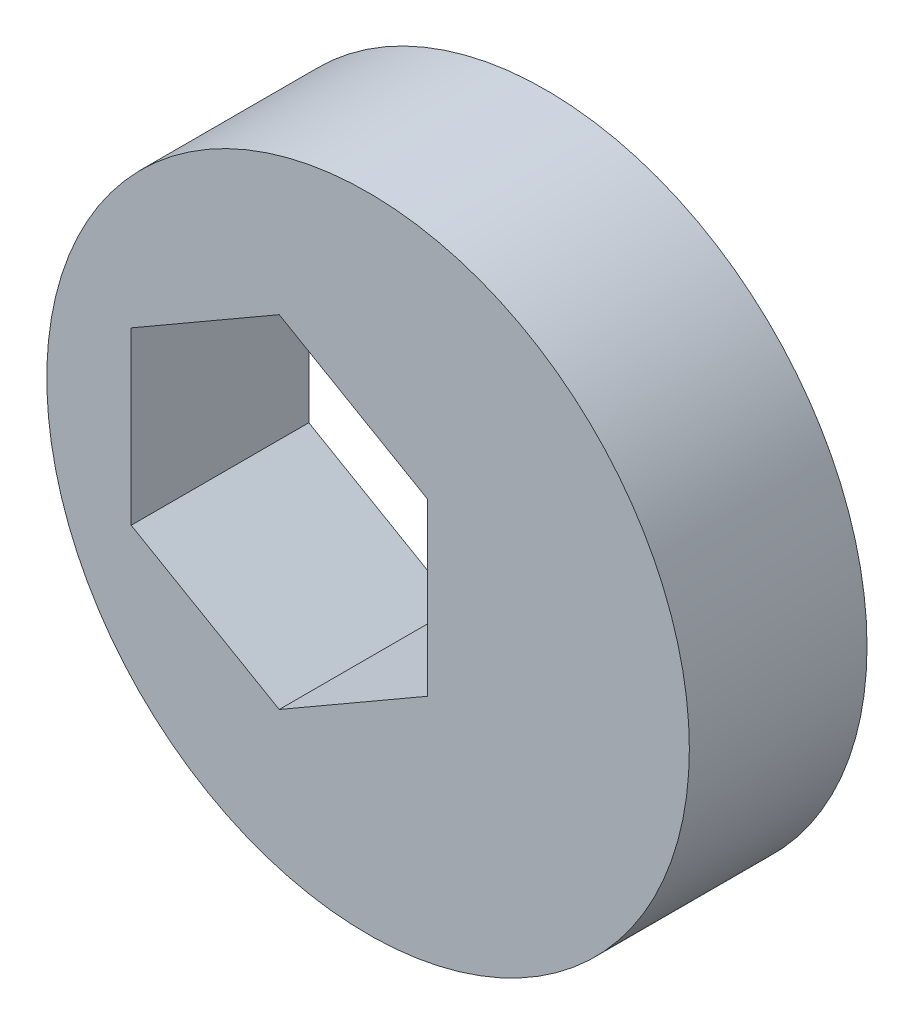
ISO-10303-21;
HEADER;
FILE_DESCRIPTION(('STEP AP214'),'2;1');
FILE_NAME('part.step','',(''),(''),'','','');
FILE_SCHEMA(('AUTOMOTIVE_DESIGN { 1 0 10303 214 1 1 1 1 }'));
ENDSEC;
DATA;
#1=APPLICATION_CONTEXT('core data for automotive mechanical design processes');
#2=APPLICATION_PROTOCOL_DEFINITION('international standard','automotive_design',2000,#1);
#3=PRODUCT_CONTEXT('',#1,'mechanical');
#4=PRODUCT('Part','Part','',(#3));
#5=PRODUCT_RELATED_PRODUCT_CATEGORY('part','',(#4));
#6=PRODUCT_DEFINITION_FORMATION('','',#4);
#7=PRODUCT_DEFINITION_CONTEXT('part definition',#1,'design');
#8=PRODUCT_DEFINITION('design','',#6,#7);
#9=PRODUCT_DEFINITION_SHAPE('','',#8);
#10=(LENGTH_UNIT() NAMED_UNIT(*) SI_UNIT(.MILLI.,.METRE.));
#11=(NAMED_UNIT(*) PLANE_ANGLE_UNIT() SI_UNIT($,.RADIAN.));
#12=(NAMED_UNIT(*) SI_UNIT($,.STERADIAN.) SOLID_ANGLE_UNIT());
#13=UNCERTAINTY_MEASURE_WITH_UNIT(LENGTH_MEASURE(1.E-05),#10,'distance_accuracy_value','');
#14=(GEOMETRIC_REPRESENTATION_CONTEXT(3) GLOBAL_UNCERTAINTY_ASSIGNED_CONTEXT((#13)) GLOBAL_UNIT_ASSIGNED_CONTEXT((#10,
#11,#12)) REPRESENTATION_CONTEXT('',''));
#15=CARTESIAN_POINT('',(0.,0.,0.));
#16=DIRECTION('',(0.,0.,1.));
#17=DIRECTION('',(1.,0.,0.));
#18=AXIS2_PLACEMENT_3D('',#15,#16,#17);
#19=CARTESIAN_POINT('',(3.55037457508512,0.,-4.2));
#20=DIRECTION('',(0.,0.,1.));
#21=DIRECTION('',(1.,0.,0.));
#22=AXIS2_PLACEMENT_3D('',#19,#20,#21);
#23=CYLINDRICAL_SURFACE('',#22,4.34);
#24=CARTESIAN_POINT('',(3.55037457508512,0.,-4.2));
#25=DIRECTION('',(0.,0.,1.));
#26=DIRECTION('',(1.,0.,0.));
#27=AXIS2_PLACEMENT_3D('',#24,#25,#26);
#28=CIRCLE('',#27,4.34);
#29=CARTESIAN_POINT('',(7.89037457508512,0.,-4.2));
#30=VERTEX_POINT('',#29);
#31=EDGE_CURVE('E11',#30,#30,#28,.T.);
#32=ORIENTED_EDGE('',*,*,#31,.T.);
#33=EDGE_LOOP('',(#32));
#34=FACE_BOUND('',#33,.T.);
#35=CARTESIAN_POINT('',(3.55037457508512,0.,-1.8));
#36=DIRECTION('',(0.,0.,1.));
#37=DIRECTION('',(1.,0.,0.));
#38=AXIS2_PLACEMENT_3D('',#35,#36,#37);
#39=CIRCLE('',#38,4.34);
#40=CARTESIAN_POINT('',(7.89037457508512,0.,-1.8));
#41=VERTEX_POINT('',#40);
#42=EDGE_CURVE('E49',#41,#41,#39,.T.);
#43=ORIENTED_EDGE('',*,*,#42,.F.);
#44=EDGE_LOOP('',(#43));
#45=FACE_BOUND('',#44,.T.);
#46=ADVANCED_FACE('F46',(#34,#45),#23,.T.);
#47=CARTESIAN_POINT('',(3.55037457508512,0.,-4.2));
#48=DIRECTION('',(0.,0.,1.));
#49=DIRECTION('',(1.,0.,0.));
#50=AXIS2_PLACEMENT_3D('',#47,#48,#49);
#51=PLANE('',#50);
#52=DIRECTION('',(0.,1.,0.));
#53=VECTOR('',#52,1.);
#54=CARTESIAN_POINT('',(4.35037457508512,-1.15470053837926,-4.2));
#55=LINE('',#54,#53);
#56=CARTESIAN_POINT('',(4.35037457508512,-1.15470053837926,-4.2));
#57=VERTEX_POINT('',#56);
#58=CARTESIAN_POINT('',(4.35037457508512,1.15470053837926,-4.2));
#59=VERTEX_POINT('',#58);
#60=EDGE_CURVE('E108',#57,#59,#55,.T.);
#61=ORIENTED_EDGE('',*,*,#60,.T.);
#62=DIRECTION('',(-0.866025403784439,0.5,0.));
#63=VECTOR('',#62,1.);
#64=CARTESIAN_POINT('',(4.35037457508512,1.15470053837926,-4.2));
#65=LINE('',#64,#63);
#66=CARTESIAN_POINT('',(2.35037457508512,2.30940107675851,-4.2));
#67=VERTEX_POINT('',#66);
#68=EDGE_CURVE('E101',#59,#67,#65,.T.);
#69=ORIENTED_EDGE('',*,*,#68,.T.);
#70=DIRECTION('',(-0.866025403784439,-0.5,0.));
#71=VECTOR('',#70,1.);
#72=CARTESIAN_POINT('',(2.35037457508512,2.30940107675851,-4.2));
#73=LINE('',#72,#71);
#74=CARTESIAN_POINT('',(0.350374575085108,1.15470053837926,-4.2));
#75=VERTEX_POINT('',#74);
#76=EDGE_CURVE('E111',#67,#75,#73,.T.);
#77=ORIENTED_EDGE('',*,*,#76,.T.);
#78=DIRECTION('',(0.,-1.,0.));
#79=VECTOR('',#78,1.);
#80=CARTESIAN_POINT('',(0.350374575085107,1.15470053837926,-4.2));
#81=LINE('',#80,#79);
#82=CARTESIAN_POINT('',(0.350374575085107,-1.15470053837926,-4.2));
#83=VERTEX_POINT('',#82);
#84=EDGE_CURVE('E61',#75,#83,#81,.T.);
#85=ORIENTED_EDGE('',*,*,#84,.T.);
#86=DIRECTION('',(0.866025403784438,-0.5,0.));
#87=VECTOR('',#86,1.);
#88=CARTESIAN_POINT('',(0.350374575085107,-1.15470053837926,-4.2));
#89=LINE('',#88,#87);
#90=CARTESIAN_POINT('',(2.35037457508511,-2.30940107675851,-4.2));
#91=VERTEX_POINT('',#90);
#92=EDGE_CURVE('E130',#83,#91,#89,.T.);
#93=ORIENTED_EDGE('',*,*,#92,.T.);
#94=DIRECTION('',(0.866025403784439,0.5,0.));
#95=VECTOR('',#94,1.);
#96=CARTESIAN_POINT('',(2.35037457508511,-2.30940107675851,-4.2));
#97=LINE('',#96,#95);
#98=EDGE_CURVE('E134',#91,#57,#97,.T.);
#99=ORIENTED_EDGE('',*,*,#98,.T.);
#100=EDGE_LOOP('',(#61,#69,#77,#85,#93,#99));
#101=FACE_BOUND('',#100,.T.);
#102=ORIENTED_EDGE('',*,*,#31,.F.);
#103=EDGE_LOOP('',(#102));
#104=FACE_BOUND('',#103,.T.);
#105=ADVANCED_FACE('F116',(#101,#104),#51,.F.);
#106=CARTESIAN_POINT('',(3.55037457508512,0.,-1.8));
#107=DIRECTION('',(0.,0.,1.));
#108=DIRECTION('',(1.,0.,0.));
#109=AXIS2_PLACEMENT_3D('',#106,#107,#108);
#110=PLANE('',#109);
#111=DIRECTION('',(-0.866025403784439,0.5,0.));
#112=VECTOR('',#111,1.);
#113=CARTESIAN_POINT('',(4.35037457508512,1.15470053837926,-1.8));
#114=LINE('',#113,#112);
#115=CARTESIAN_POINT('',(4.35037457508512,1.15470053837926,-1.8));
#116=VERTEX_POINT('',#115);
#117=CARTESIAN_POINT('',(2.35037457508512,2.30940107675851,-1.8));
#118=VERTEX_POINT('',#117);
#119=EDGE_CURVE('E69',#116,#118,#114,.T.);
#120=ORIENTED_EDGE('',*,*,#119,.F.);
#121=DIRECTION('',(0.,1.,0.));
#122=VECTOR('',#121,1.);
#123=CARTESIAN_POINT('',(4.35037457508512,-1.15470053837926,-1.8));
#124=LINE('',#123,#122);
#125=CARTESIAN_POINT('',(4.35037457508512,-1.15470053837926,-1.8));
#126=VERTEX_POINT('',#125);
#127=EDGE_CURVE('E121',#126,#116,#124,.T.);
#128=ORIENTED_EDGE('',*,*,#127,.F.);
#129=DIRECTION('',(0.866025403784439,0.5,0.));
#130=VECTOR('',#129,1.);
#131=CARTESIAN_POINT('',(2.35037457508511,-2.30940107675851,-1.8));
#132=LINE('',#131,#130);
#133=CARTESIAN_POINT('',(2.35037457508511,-2.30940107675851,-1.8));
#134=VERTEX_POINT('',#133);
#135=EDGE_CURVE('E125',#134,#126,#132,.T.);
#136=ORIENTED_EDGE('',*,*,#135,.F.);
#137=DIRECTION('',(0.866025403784438,-0.5,0.));
#138=VECTOR('',#137,1.);
#139=CARTESIAN_POINT('',(0.350374575085107,-1.15470053837926,-1.8));
#140=LINE('',#139,#138);
#141=CARTESIAN_POINT('',(0.350374575085107,-1.15470053837926,-1.8));
#142=VERTEX_POINT('',#141);
#143=EDGE_CURVE('E148',#142,#134,#140,.T.);
#144=ORIENTED_EDGE('',*,*,#143,.F.);
#145=DIRECTION('',(0.,-1.,0.));
#146=VECTOR('',#145,1.);
#147=CARTESIAN_POINT('',(0.350374575085107,1.15470053837926,-1.8));
#148=LINE('',#147,#146);
#149=CARTESIAN_POINT('',(0.350374575085107,1.15470053837926,-1.8));
#150=VERTEX_POINT('',#149);
#151=EDGE_CURVE('E144',#150,#142,#148,.T.);
#152=ORIENTED_EDGE('',*,*,#151,.F.);
#153=DIRECTION('',(-0.866025403784439,-0.5,0.));
#154=VECTOR('',#153,1.);
#155=CARTESIAN_POINT('',(2.35037457508512,2.30940107675851,-1.8));
#156=LINE('',#155,#154);
#157=EDGE_CURVE('E141',#118,#150,#156,.T.);
#158=ORIENTED_EDGE('',*,*,#157,.F.);
#159=EDGE_LOOP('',(#120,#128,#136,#144,#152,#158));
#160=FACE_BOUND('',#159,.T.);
#161=ORIENTED_EDGE('',*,*,#42,.T.);
#162=EDGE_LOOP('',(#161));
#163=FACE_BOUND('',#162,.T.);
#164=ADVANCED_FACE('F172',(#160,#163),#110,.T.);
#165=CARTESIAN_POINT('',(4.35037457508512,1.15470053837926,-4.2));
#166=DIRECTION('',(0.5,0.866025403784439,0.));
#167=DIRECTION('',(-0.866025403784439,0.5,0.));
#168=AXIS2_PLACEMENT_3D('',#165,#166,#167);
#169=PLANE('',#168);
#170=ORIENTED_EDGE('',*,*,#119,.T.);
#171=DIRECTION('',(0.,0.,1.));
#172=VECTOR('',#171,1.);
#173=CARTESIAN_POINT('',(2.35037457508512,2.30940107675851,-4.2));
#174=LINE('',#173,#172);
#175=EDGE_CURVE('E97',#67,#118,#174,.T.);
#176=ORIENTED_EDGE('',*,*,#175,.F.);
#177=ORIENTED_EDGE('',*,*,#68,.F.);
#178=DIRECTION('',(0.,0.,1.));
#179=VECTOR('',#178,1.);
#180=CARTESIAN_POINT('',(4.35037457508512,1.15470053837926,-4.2));
#181=LINE('',#180,#179);
#182=EDGE_CURVE('E155',#59,#116,#181,.T.);
#183=ORIENTED_EDGE('',*,*,#182,.T.);
#184=EDGE_LOOP('',(#170,#176,#177,#183));
#185=FACE_BOUND('',#184,.T.);
#186=ADVANCED_FACE('F99',(#185),#169,.F.);
#187=CARTESIAN_POINT('',(4.35037457508512,-1.15470053837926,-4.2));
#188=DIRECTION('',(1.,0.,0.));
#189=DIRECTION('',(0.,0.,-1.));
#190=AXIS2_PLACEMENT_3D('',#187,#188,#189);
#191=PLANE('',#190);
#192=ORIENTED_EDGE('',*,*,#127,.T.);
#193=ORIENTED_EDGE('',*,*,#182,.F.);
#194=ORIENTED_EDGE('',*,*,#60,.F.);
#195=DIRECTION('',(0.,0.,1.));
#196=VECTOR('',#195,1.);
#197=CARTESIAN_POINT('',(4.35037457508512,-1.15470053837926,-4.2));
#198=LINE('',#197,#196);
#199=EDGE_CURVE('E158',#57,#126,#198,.T.);
#200=ORIENTED_EDGE('',*,*,#199,.T.);
#201=EDGE_LOOP('',(#192,#193,#194,#200));
#202=FACE_BOUND('',#201,.T.);
#203=ADVANCED_FACE('F183',(#202),#191,.F.);
#204=CARTESIAN_POINT('',(2.35037457508511,-2.30940107675851,-4.2));
#205=DIRECTION('',(0.5,-0.866025403784439,0.));
#206=DIRECTION('',(0.866025403784439,0.5,0.));
#207=AXIS2_PLACEMENT_3D('',#204,#205,#206);
#208=PLANE('',#207);
#209=ORIENTED_EDGE('',*,*,#135,.T.);
#210=ORIENTED_EDGE('',*,*,#199,.F.);
#211=ORIENTED_EDGE('',*,*,#98,.F.);
#212=DIRECTION('',(0.,0.,1.));
#213=VECTOR('',#212,1.);
#214=CARTESIAN_POINT('',(2.35037457508511,-2.30940107675851,-4.2));
#215=LINE('',#214,#213);
#216=EDGE_CURVE('E161',#91,#134,#215,.T.);
#217=ORIENTED_EDGE('',*,*,#216,.T.);
#218=EDGE_LOOP('',(#209,#210,#211,#217));
#219=FACE_BOUND('',#218,.T.);
#220=ADVANCED_FACE('F181',(#219),#208,.F.);
#221=CARTESIAN_POINT('',(0.350374575085107,-1.15470053837926,-4.2));
#222=DIRECTION('',(-0.5,-0.866025403784439,0.));
#223=DIRECTION('',(0.866025403784439,-0.5,0.));
#224=AXIS2_PLACEMENT_3D('',#221,#222,#223);
#225=PLANE('',#224);
#226=ORIENTED_EDGE('',*,*,#143,.T.);
#227=ORIENTED_EDGE('',*,*,#216,.F.);
#228=ORIENTED_EDGE('',*,*,#92,.F.);
#229=DIRECTION('',(0.,0.,1.));
#230=VECTOR('',#229,1.);
#231=CARTESIAN_POINT('',(0.350374575085107,-1.15470053837926,-4.2));
#232=LINE('',#231,#230);
#233=EDGE_CURVE('E164',#83,#142,#232,.T.);
#234=ORIENTED_EDGE('',*,*,#233,.T.);
#235=EDGE_LOOP('',(#226,#227,#228,#234));
#236=FACE_BOUND('',#235,.T.);
#237=ADVANCED_FACE('F177',(#236),#225,.F.);
#238=CARTESIAN_POINT('',(0.350374575085107,1.15470053837926,-4.2));
#239=DIRECTION('',(-1.,0.,0.));
#240=DIRECTION('',(0.,-1.,0.));
#241=AXIS2_PLACEMENT_3D('',#238,#239,#240);
#242=PLANE('',#241);
#243=ORIENTED_EDGE('',*,*,#151,.T.);
#244=ORIENTED_EDGE('',*,*,#233,.F.);
#245=ORIENTED_EDGE('',*,*,#84,.F.);
#246=DIRECTION('',(0.,0.,1.));
#247=VECTOR('',#246,1.);
#248=CARTESIAN_POINT('',(0.350374575085107,1.15470053837926,-4.2));
#249=LINE('',#248,#247);
#250=EDGE_CURVE('E107',#75,#150,#249,.T.);
#251=ORIENTED_EDGE('',*,*,#250,.T.);
#252=EDGE_LOOP('',(#243,#244,#245,#251));
#253=FACE_BOUND('',#252,.T.);
#254=ADVANCED_FACE('F168',(#253),#242,.F.);
#255=CARTESIAN_POINT('',(2.35037457508512,2.30940107675851,-4.2));
#256=DIRECTION('',(-0.5,0.866025403784439,0.));
#257=DIRECTION('',(-0.866025403784439,-0.5,0.));
#258=AXIS2_PLACEMENT_3D('',#255,#256,#257);
#259=PLANE('',#258);
#260=ORIENTED_EDGE('',*,*,#157,.T.);
#261=ORIENTED_EDGE('',*,*,#250,.F.);
#262=ORIENTED_EDGE('',*,*,#76,.F.);
#263=ORIENTED_EDGE('',*,*,#175,.T.);
#264=EDGE_LOOP('',(#260,#261,#262,#263));
#265=FACE_BOUND('',#264,.T.);
#266=ADVANCED_FACE('F112',(#265),#259,.F.);
#267=CLOSED_SHELL('',(#46,#105,#164,#186,#203,#220,#237,#254,#266));
#268=MANIFOLD_SOLID_BREP('B2',#267);
#269=ADVANCED_BREP_SHAPE_REPRESENTATION('',(#18,#268),#14);
#270=SHAPE_DEFINITION_REPRESENTATION(#9,#269);
ENDSEC;
END-ISO-10303-21;
